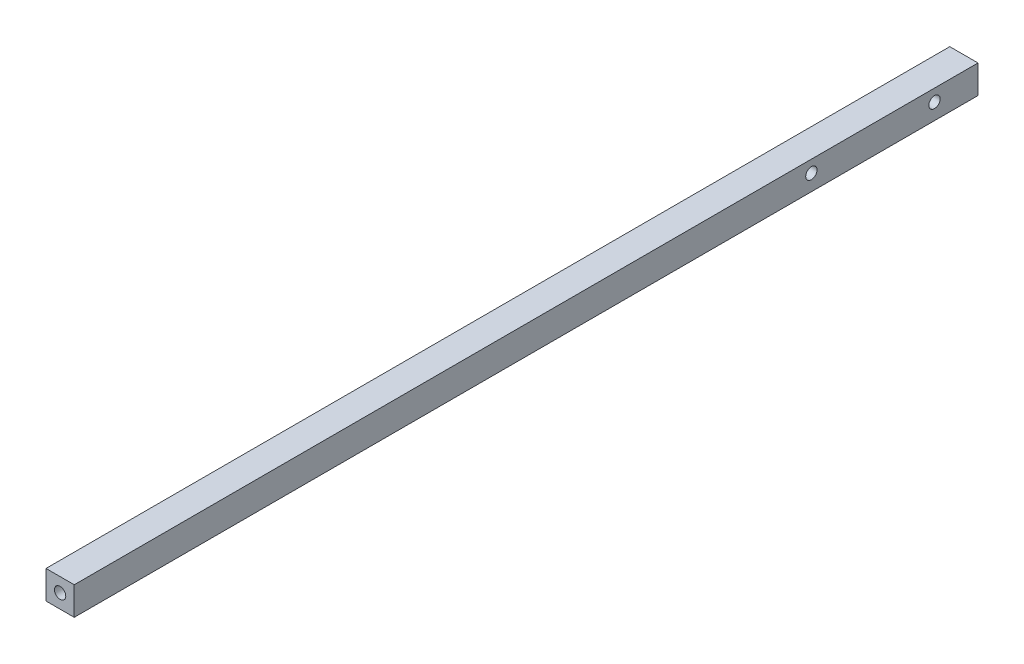
ISO-10303-21;
HEADER;
FILE_DESCRIPTION(('STEP AP214'),'2;1');
FILE_NAME('part.step','',(''),(''),'','','');
FILE_SCHEMA(('AUTOMOTIVE_DESIGN { 1 0 10303 214 1 1 1 1 }'));
ENDSEC;
DATA;
#1=APPLICATION_CONTEXT('core data for automotive mechanical design processes');
#2=APPLICATION_PROTOCOL_DEFINITION('international standard','automotive_design',2000,#1);
#3=PRODUCT_CONTEXT('',#1,'mechanical');
#4=PRODUCT('Part','Part','',(#3));
#5=PRODUCT_RELATED_PRODUCT_CATEGORY('part','',(#4));
#6=PRODUCT_DEFINITION_FORMATION('','',#4);
#7=PRODUCT_DEFINITION_CONTEXT('part definition',#1,'design');
#8=PRODUCT_DEFINITION('design','',#6,#7);
#9=PRODUCT_DEFINITION_SHAPE('','',#8);
#10=(LENGTH_UNIT() NAMED_UNIT(*) SI_UNIT(.MILLI.,.METRE.));
#11=(NAMED_UNIT(*) PLANE_ANGLE_UNIT() SI_UNIT($,.RADIAN.));
#12=(NAMED_UNIT(*) SI_UNIT($,.STERADIAN.) SOLID_ANGLE_UNIT());
#13=UNCERTAINTY_MEASURE_WITH_UNIT(LENGTH_MEASURE(1.E-05),#10,'distance_accuracy_value','');
#14=(GEOMETRIC_REPRESENTATION_CONTEXT(3) GLOBAL_UNCERTAINTY_ASSIGNED_CONTEXT((#13)) GLOBAL_UNIT_ASSIGNED_CONTEXT((#10,
#11,#12)) REPRESENTATION_CONTEXT('',''));
#15=CARTESIAN_POINT('',(0.,0.,0.));
#16=DIRECTION('',(0.,0.,1.));
#17=DIRECTION('',(1.,0.,0.));
#18=AXIS2_PLACEMENT_3D('',#15,#16,#17);
#19=CARTESIAN_POINT('',(0.,0.,320.));
#20=DIRECTION('',(1.,0.,0.));
#21=DIRECTION('',(0.,0.,-1.));
#22=AXIS2_PLACEMENT_3D('',#19,#20,#21);
#23=PLANE('',#22);
#24=CARTESIAN_POINT('',(0.,5.7,59.));
#25=DIRECTION('',(-1.,0.,0.));
#26=DIRECTION('',(0.,0.,1.));
#27=AXIS2_PLACEMENT_3D('',#24,#25,#26);
#28=CIRCLE('',#27,2.);
#29=CARTESIAN_POINT('',(0.,5.7,61.));
#30=VERTEX_POINT('',#29);
#31=EDGE_CURVE('E116',#30,#30,#28,.T.);
#32=ORIENTED_EDGE('',*,*,#31,.F.);
#33=EDGE_LOOP('',(#32));
#34=FACE_BOUND('',#33,.T.);
#35=CARTESIAN_POINT('',(0.,5.69999999999999,15.4));
#36=DIRECTION('',(-1.,0.,0.));
#37=DIRECTION('',(0.,0.,1.));
#38=AXIS2_PLACEMENT_3D('',#35,#36,#37);
#39=CIRCLE('',#38,2.);
#40=CARTESIAN_POINT('',(0.,5.69999999999999,17.4));
#41=VERTEX_POINT('',#40);
#42=EDGE_CURVE('E110',#41,#41,#39,.T.);
#43=ORIENTED_EDGE('',*,*,#42,.F.);
#44=EDGE_LOOP('',(#43));
#45=FACE_BOUND('',#44,.T.);
#46=DIRECTION('',(0.,-1.,0.));
#47=VECTOR('',#46,1.);
#48=CARTESIAN_POINT('',(0.,0.,0.));
#49=LINE('',#48,#47);
#50=CARTESIAN_POINT('',(0.,10.,0.));
#51=VERTEX_POINT('',#50);
#52=CARTESIAN_POINT('',(0.,0.,0.));
#53=VERTEX_POINT('',#52);
#54=EDGE_CURVE('E96',#51,#53,#49,.T.);
#55=ORIENTED_EDGE('',*,*,#54,.T.);
#56=DIRECTION('',(0.,0.,-1.));
#57=VECTOR('',#56,1.);
#58=CARTESIAN_POINT('',(0.,0.,320.));
#59=LINE('',#58,#57);
#60=CARTESIAN_POINT('',(0.,0.,320.));
#61=VERTEX_POINT('',#60);
#62=EDGE_CURVE('E11',#61,#53,#59,.T.);
#63=ORIENTED_EDGE('',*,*,#62,.F.);
#64=DIRECTION('',(0.,-1.,0.));
#65=VECTOR('',#64,1.);
#66=CARTESIAN_POINT('',(0.,0.,320.));
#67=LINE('',#66,#65);
#68=CARTESIAN_POINT('',(0.,10.,320.));
#69=VERTEX_POINT('',#68);
#70=EDGE_CURVE('E84',#69,#61,#67,.T.);
#71=ORIENTED_EDGE('',*,*,#70,.F.);
#72=DIRECTION('',(0.,0.,-1.));
#73=VECTOR('',#72,1.);
#74=CARTESIAN_POINT('',(0.,10.,320.));
#75=LINE('',#74,#73);
#76=EDGE_CURVE('E92',#69,#51,#75,.T.);
#77=ORIENTED_EDGE('',*,*,#76,.T.);
#78=EDGE_LOOP('',(#55,#63,#71,#77));
#79=FACE_BOUND('',#78,.T.);
#80=ADVANCED_FACE('F33',(#34,#45,#79),#23,.F.);
#81=CARTESIAN_POINT('',(0.,0.,320.));
#82=DIRECTION('',(0.,1.,0.));
#83=DIRECTION('',(0.,0.,1.));
#84=AXIS2_PLACEMENT_3D('',#81,#82,#83);
#85=PLANE('',#84);
#86=DIRECTION('',(1.,0.,0.));
#87=VECTOR('',#86,1.);
#88=CARTESIAN_POINT('',(0.,0.,0.));
#89=LINE('',#88,#87);
#90=CARTESIAN_POINT('',(10.,0.,0.));
#91=VERTEX_POINT('',#90);
#92=EDGE_CURVE('E88',#53,#91,#89,.T.);
#93=ORIENTED_EDGE('',*,*,#92,.T.);
#94=DIRECTION('',(0.,0.,-1.));
#95=VECTOR('',#94,1.);
#96=CARTESIAN_POINT('',(10.,0.,320.));
#97=LINE('',#96,#95);
#98=CARTESIAN_POINT('',(10.,0.,320.));
#99=VERTEX_POINT('',#98);
#100=EDGE_CURVE('E41',#99,#91,#97,.T.);
#101=ORIENTED_EDGE('',*,*,#100,.F.);
#102=DIRECTION('',(1.,0.,0.));
#103=VECTOR('',#102,1.);
#104=CARTESIAN_POINT('',(0.,0.,320.));
#105=LINE('',#104,#103);
#106=EDGE_CURVE('E79',#61,#99,#105,.T.);
#107=ORIENTED_EDGE('',*,*,#106,.F.);
#108=ORIENTED_EDGE('',*,*,#62,.T.);
#109=EDGE_LOOP('',(#93,#101,#107,#108));
#110=FACE_BOUND('',#109,.T.);
#111=ADVANCED_FACE('F87',(#110),#85,.F.);
#112=CARTESIAN_POINT('',(10.,0.,320.));
#113=DIRECTION('',(-1.,0.,0.));
#114=DIRECTION('',(0.,0.,1.));
#115=AXIS2_PLACEMENT_3D('',#112,#113,#114);
#116=PLANE('',#115);
#117=CARTESIAN_POINT('',(10.,5.7,59.));
#118=DIRECTION('',(-1.,0.,0.));
#119=DIRECTION('',(0.,0.,1.));
#120=AXIS2_PLACEMENT_3D('',#117,#118,#119);
#121=CIRCLE('',#120,2.);
#122=CARTESIAN_POINT('',(10.,5.7,61.));
#123=VERTEX_POINT('',#122);
#124=EDGE_CURVE('E113',#123,#123,#121,.T.);
#125=ORIENTED_EDGE('',*,*,#124,.T.);
#126=EDGE_LOOP('',(#125));
#127=FACE_BOUND('',#126,.T.);
#128=CARTESIAN_POINT('',(10.,5.69999999999999,15.4));
#129=DIRECTION('',(-1.,0.,0.));
#130=DIRECTION('',(0.,0.,1.));
#131=AXIS2_PLACEMENT_3D('',#128,#129,#130);
#132=CIRCLE('',#131,2.);
#133=CARTESIAN_POINT('',(10.,5.69999999999999,17.4));
#134=VERTEX_POINT('',#133);
#135=EDGE_CURVE('E99',#134,#134,#132,.T.);
#136=ORIENTED_EDGE('',*,*,#135,.T.);
#137=EDGE_LOOP('',(#136));
#138=FACE_BOUND('',#137,.T.);
#139=DIRECTION('',(0.,1.,0.));
#140=VECTOR('',#139,1.);
#141=CARTESIAN_POINT('',(10.,0.,0.));
#142=LINE('',#141,#140);
#143=CARTESIAN_POINT('',(10.,10.,0.));
#144=VERTEX_POINT('',#143);
#145=EDGE_CURVE('E66',#91,#144,#142,.T.);
#146=ORIENTED_EDGE('',*,*,#145,.T.);
#147=DIRECTION('',(0.,0.,-1.));
#148=VECTOR('',#147,1.);
#149=CARTESIAN_POINT('',(10.,10.,320.));
#150=LINE('',#149,#148);
#151=CARTESIAN_POINT('',(10.,10.,320.));
#152=VERTEX_POINT('',#151);
#153=EDGE_CURVE('E89',#152,#144,#150,.T.);
#154=ORIENTED_EDGE('',*,*,#153,.F.);
#155=DIRECTION('',(0.,1.,0.));
#156=VECTOR('',#155,1.);
#157=CARTESIAN_POINT('',(10.,0.,320.));
#158=LINE('',#157,#156);
#159=EDGE_CURVE('E82',#99,#152,#158,.T.);
#160=ORIENTED_EDGE('',*,*,#159,.F.);
#161=ORIENTED_EDGE('',*,*,#100,.T.);
#162=EDGE_LOOP('',(#146,#154,#160,#161));
#163=FACE_BOUND('',#162,.T.);
#164=ADVANCED_FACE('F90',(#127,#138,#163),#116,.F.);
#165=CARTESIAN_POINT('',(0.,10.,320.));
#166=DIRECTION('',(0.,-1.,0.));
#167=DIRECTION('',(0.,0.,-1.));
#168=AXIS2_PLACEMENT_3D('',#165,#166,#167);
#169=PLANE('',#168);
#170=DIRECTION('',(-1.,0.,0.));
#171=VECTOR('',#170,1.);
#172=CARTESIAN_POINT('',(0.,10.,0.));
#173=LINE('',#172,#171);
#174=EDGE_CURVE('E72',#144,#51,#173,.T.);
#175=ORIENTED_EDGE('',*,*,#174,.T.);
#176=ORIENTED_EDGE('',*,*,#76,.F.);
#177=DIRECTION('',(-1.,0.,0.));
#178=VECTOR('',#177,1.);
#179=CARTESIAN_POINT('',(0.,10.,320.));
#180=LINE('',#179,#178);
#181=EDGE_CURVE('E49',#152,#69,#180,.T.);
#182=ORIENTED_EDGE('',*,*,#181,.F.);
#183=ORIENTED_EDGE('',*,*,#153,.T.);
#184=EDGE_LOOP('',(#175,#176,#182,#183));
#185=FACE_BOUND('',#184,.T.);
#186=ADVANCED_FACE('F104',(#185),#169,.F.);
#187=CARTESIAN_POINT('',(0.,0.,320.));
#188=DIRECTION('',(0.,0.,-1.));
#189=DIRECTION('',(-1.,0.,0.));
#190=AXIS2_PLACEMENT_3D('',#187,#188,#189);
#191=PLANE('',#190);
#192=CARTESIAN_POINT('',(5.,5.,320.));
#193=DIRECTION('',(0.,0.,1.));
#194=DIRECTION('',(1.,0.,0.));
#195=AXIS2_PLACEMENT_3D('',#192,#193,#194);
#196=CIRCLE('',#195,2.);
#197=CARTESIAN_POINT('',(7.,5.,320.));
#198=VERTEX_POINT('',#197);
#199=EDGE_CURVE('E128',#198,#198,#196,.T.);
#200=ORIENTED_EDGE('',*,*,#199,.F.);
#201=EDGE_LOOP('',(#200));
#202=FACE_BOUND('',#201,.T.);
#203=ORIENTED_EDGE('',*,*,#70,.T.);
#204=ORIENTED_EDGE('',*,*,#106,.T.);
#205=ORIENTED_EDGE('',*,*,#159,.T.);
#206=ORIENTED_EDGE('',*,*,#181,.T.);
#207=EDGE_LOOP('',(#203,#204,#205,#206));
#208=FACE_BOUND('',#207,.T.);
#209=ADVANCED_FACE('F80',(#202,#208),#191,.F.);
#210=CARTESIAN_POINT('',(0.,0.,0.));
#211=DIRECTION('',(0.,0.,-1.));
#212=DIRECTION('',(-1.,0.,0.));
#213=AXIS2_PLACEMENT_3D('',#210,#211,#212);
#214=PLANE('',#213);
#215=CARTESIAN_POINT('',(5.,5.,0.));
#216=DIRECTION('',(0.,0.,-1.));
#217=DIRECTION('',(-1.,0.,0.));
#218=AXIS2_PLACEMENT_3D('',#215,#216,#217);
#219=CIRCLE('',#218,2.);
#220=CARTESIAN_POINT('',(3.,5.,0.));
#221=VERTEX_POINT('',#220);
#222=EDGE_CURVE('E122',#221,#221,#219,.T.);
#223=ORIENTED_EDGE('',*,*,#222,.F.);
#224=EDGE_LOOP('',(#223));
#225=FACE_BOUND('',#224,.T.);
#226=ORIENTED_EDGE('',*,*,#54,.F.);
#227=ORIENTED_EDGE('',*,*,#174,.F.);
#228=ORIENTED_EDGE('',*,*,#145,.F.);
#229=ORIENTED_EDGE('',*,*,#92,.F.);
#230=EDGE_LOOP('',(#226,#227,#228,#229));
#231=FACE_BOUND('',#230,.T.);
#232=ADVANCED_FACE('F107',(#225,#231),#214,.T.);
#233=CARTESIAN_POINT('',(10.,5.69999999999999,15.4));
#234=DIRECTION('',(-1.,0.,0.));
#235=DIRECTION('',(0.,0.,1.));
#236=AXIS2_PLACEMENT_3D('',#233,#234,#235);
#237=CYLINDRICAL_SURFACE('',#236,2.);
#238=ORIENTED_EDGE('',*,*,#135,.F.);
#239=EDGE_LOOP('',(#238));
#240=FACE_BOUND('',#239,.T.);
#241=ORIENTED_EDGE('',*,*,#42,.T.);
#242=EDGE_LOOP('',(#241));
#243=FACE_BOUND('',#242,.T.);
#244=ADVANCED_FACE('F149',(#240,#243),#237,.F.);
#245=CARTESIAN_POINT('',(10.,5.7,59.));
#246=DIRECTION('',(-1.,0.,0.));
#247=DIRECTION('',(0.,0.,1.));
#248=AXIS2_PLACEMENT_3D('',#245,#246,#247);
#249=CYLINDRICAL_SURFACE('',#248,2.);
#250=ORIENTED_EDGE('',*,*,#124,.F.);
#251=EDGE_LOOP('',(#250));
#252=FACE_BOUND('',#251,.T.);
#253=ORIENTED_EDGE('',*,*,#31,.T.);
#254=EDGE_LOOP('',(#253));
#255=FACE_BOUND('',#254,.T.);
#256=ADVANCED_FACE('F164',(#252,#255),#249,.F.);
#257=CARTESIAN_POINT('',(5.,5.,6.));
#258=DIRECTION('',(0.,0.,-1.));
#259=DIRECTION('',(-1.,0.,0.));
#260=AXIS2_PLACEMENT_3D('',#257,#258,#259);
#261=CYLINDRICAL_SURFACE('',#260,2.);
#262=CARTESIAN_POINT('',(5.,5.,6.));
#263=DIRECTION('',(0.,0.,-1.));
#264=DIRECTION('',(-1.,0.,0.));
#265=AXIS2_PLACEMENT_3D('',#262,#263,#264);
#266=CIRCLE('',#265,2.);
#267=CARTESIAN_POINT('',(3.,5.,6.));
#268=VERTEX_POINT('',#267);
#269=EDGE_CURVE('E119',#268,#268,#266,.T.);
#270=ORIENTED_EDGE('',*,*,#269,.F.);
#271=EDGE_LOOP('',(#270));
#272=FACE_BOUND('',#271,.T.);
#273=ORIENTED_EDGE('',*,*,#222,.T.);
#274=EDGE_LOOP('',(#273));
#275=FACE_BOUND('',#274,.T.);
#276=ADVANCED_FACE('F169',(#272,#275),#261,.F.);
#277=CARTESIAN_POINT('',(5.,5.,6.));
#278=DIRECTION('',(0.,0.,-1.));
#279=DIRECTION('',(-1.,0.,0.));
#280=AXIS2_PLACEMENT_3D('',#277,#278,#279);
#281=PLANE('',#280);
#282=ORIENTED_EDGE('',*,*,#269,.T.);
#283=EDGE_LOOP('',(#282));
#284=FACE_BOUND('',#283,.T.);
#285=ADVANCED_FACE('F139',(#284),#281,.T.);
#286=CARTESIAN_POINT('',(5.,5.,314.));
#287=DIRECTION('',(0.,0.,1.));
#288=DIRECTION('',(1.,0.,0.));
#289=AXIS2_PLACEMENT_3D('',#286,#287,#288);
#290=CYLINDRICAL_SURFACE('',#289,2.);
#291=CARTESIAN_POINT('',(5.,5.,314.));
#292=DIRECTION('',(0.,0.,1.));
#293=DIRECTION('',(1.,0.,0.));
#294=AXIS2_PLACEMENT_3D('',#291,#292,#293);
#295=CIRCLE('',#294,2.);
#296=CARTESIAN_POINT('',(7.,5.,314.));
#297=VERTEX_POINT('',#296);
#298=EDGE_CURVE('E125',#297,#297,#295,.T.);
#299=ORIENTED_EDGE('',*,*,#298,.F.);
#300=EDGE_LOOP('',(#299));
#301=FACE_BOUND('',#300,.T.);
#302=ORIENTED_EDGE('',*,*,#199,.T.);
#303=EDGE_LOOP('',(#302));
#304=FACE_BOUND('',#303,.T.);
#305=ADVANCED_FACE('F136',(#301,#304),#290,.F.);
#306=CARTESIAN_POINT('',(5.,5.,314.));
#307=DIRECTION('',(0.,0.,1.));
#308=DIRECTION('',(1.,0.,0.));
#309=AXIS2_PLACEMENT_3D('',#306,#307,#308);
#310=PLANE('',#309);
#311=ORIENTED_EDGE('',*,*,#298,.T.);
#312=EDGE_LOOP('',(#311));
#313=FACE_BOUND('',#312,.T.);
#314=ADVANCED_FACE('F134',(#313),#310,.T.);
#315=CLOSED_SHELL('',(#80,#111,#164,#186,#209,#232,#244,#256,#276,#285,#305,#314));
#316=MANIFOLD_SOLID_BREP('B2',#315);
#317=ADVANCED_BREP_SHAPE_REPRESENTATION('',(#18,#316),#14);
#318=SHAPE_DEFINITION_REPRESENTATION(#9,#317);
ENDSEC;
END-ISO-10303-21;
